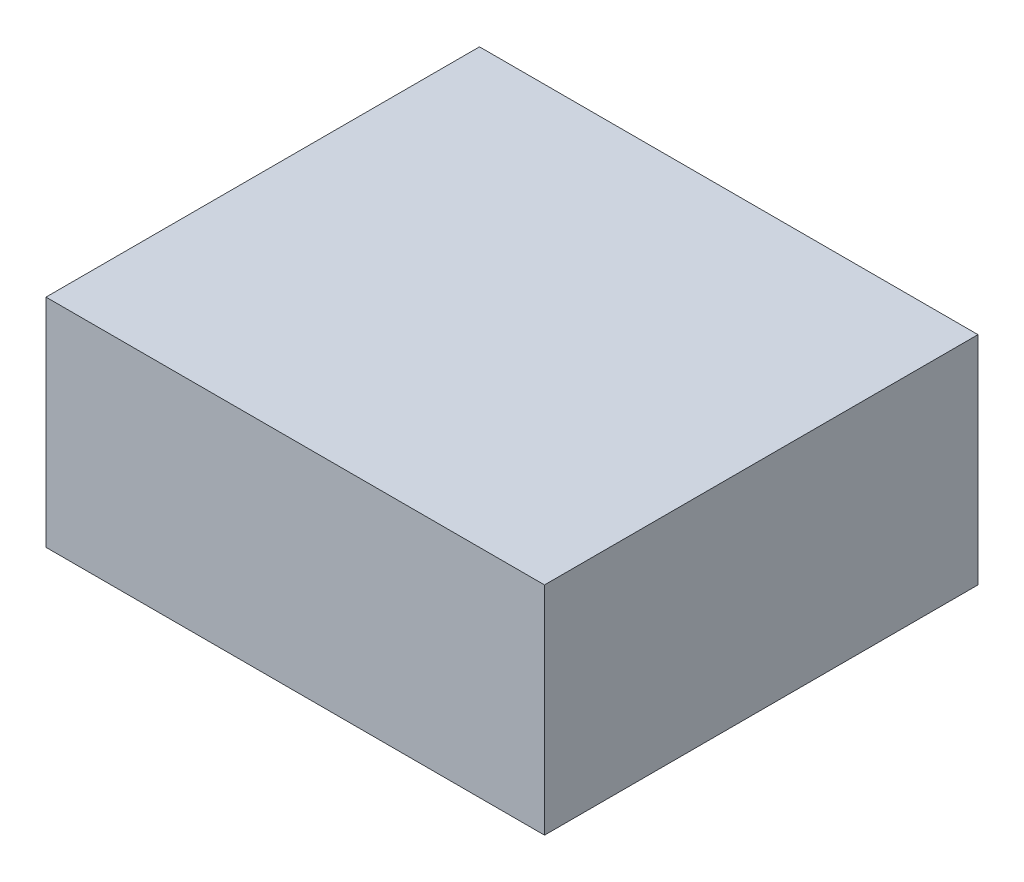
ISO-10303-21;
HEADER;
FILE_DESCRIPTION(('STEP AP214'),'2;1');
FILE_NAME('part.step','',(''),(''),'','','');
FILE_SCHEMA(('AUTOMOTIVE_DESIGN { 1 0 10303 214 1 1 1 1 }'));
ENDSEC;
DATA;
#1=APPLICATION_CONTEXT('core data for automotive mechanical design processes');
#2=APPLICATION_PROTOCOL_DEFINITION('international standard','automotive_design',2000,#1);
#3=PRODUCT_CONTEXT('',#1,'mechanical');
#4=PRODUCT('Part','Part','',(#3));
#5=PRODUCT_RELATED_PRODUCT_CATEGORY('part','',(#4));
#6=PRODUCT_DEFINITION_FORMATION('','',#4);
#7=PRODUCT_DEFINITION_CONTEXT('part definition',#1,'design');
#8=PRODUCT_DEFINITION('design','',#6,#7);
#9=PRODUCT_DEFINITION_SHAPE('','',#8);
#10=(LENGTH_UNIT() NAMED_UNIT(*) SI_UNIT(.MILLI.,.METRE.));
#11=(NAMED_UNIT(*) PLANE_ANGLE_UNIT() SI_UNIT($,.RADIAN.));
#12=(NAMED_UNIT(*) SI_UNIT($,.STERADIAN.) SOLID_ANGLE_UNIT());
#13=UNCERTAINTY_MEASURE_WITH_UNIT(LENGTH_MEASURE(1.E-05),#10,'distance_accuracy_value','');
#14=(GEOMETRIC_REPRESENTATION_CONTEXT(3) GLOBAL_UNCERTAINTY_ASSIGNED_CONTEXT((#13)) GLOBAL_UNIT_ASSIGNED_CONTEXT((#10,
#11,#12)) REPRESENTATION_CONTEXT('',''));
#15=CARTESIAN_POINT('',(0.,0.,0.));
#16=DIRECTION('',(0.,0.,1.));
#17=DIRECTION('',(1.,0.,0.));
#18=AXIS2_PLACEMENT_3D('',#15,#16,#17);
#19=CARTESIAN_POINT('',(0.,-10.,0.));
#20=DIRECTION('',(-1.,0.,0.));
#21=DIRECTION('',(0.,0.,1.));
#22=AXIS2_PLACEMENT_3D('',#19,#20,#21);
#23=PLANE('',#22);
#24=DIRECTION('',(0.,0.,1.));
#25=VECTOR('',#24,1.);
#26=CARTESIAN_POINT('',(0.,0.,0.));
#27=LINE('',#26,#25);
#28=CARTESIAN_POINT('',(0.,0.,-20.));
#29=VERTEX_POINT('',#28);
#30=CARTESIAN_POINT('',(0.,0.,0.));
#31=VERTEX_POINT('',#30);
#32=EDGE_CURVE('E104',#29,#31,#27,.T.);
#33=ORIENTED_EDGE('',*,*,#32,.F.);
#34=DIRECTION('',(0.,1.,0.));
#35=VECTOR('',#34,1.);
#36=CARTESIAN_POINT('',(0.,-10.,-20.));
#37=LINE('',#36,#35);
#38=CARTESIAN_POINT('',(0.,-10.,-20.));
#39=VERTEX_POINT('',#38);
#40=EDGE_CURVE('E11',#39,#29,#37,.T.);
#41=ORIENTED_EDGE('',*,*,#40,.F.);
#42=DIRECTION('',(0.,0.,1.));
#43=VECTOR('',#42,1.);
#44=CARTESIAN_POINT('',(0.,-10.,0.));
#45=LINE('',#44,#43);
#46=CARTESIAN_POINT('',(0.,-10.,0.));
#47=VERTEX_POINT('',#46);
#48=EDGE_CURVE('E100',#39,#47,#45,.T.);
#49=ORIENTED_EDGE('',*,*,#48,.T.);
#50=DIRECTION('',(0.,1.,0.));
#51=VECTOR('',#50,1.);
#52=CARTESIAN_POINT('',(0.,-10.,0.));
#53=LINE('',#52,#51);
#54=EDGE_CURVE('E45',#47,#31,#53,.T.);
#55=ORIENTED_EDGE('',*,*,#54,.T.);
#56=EDGE_LOOP('',(#33,#41,#49,#55));
#57=FACE_BOUND('',#56,.T.);
#58=ADVANCED_FACE('F39',(#57),#23,.T.);
#59=CARTESIAN_POINT('',(0.,-10.,-20.));
#60=DIRECTION('',(0.,0.,-1.));
#61=DIRECTION('',(-1.,0.,0.));
#62=AXIS2_PLACEMENT_3D('',#59,#60,#61);
#63=PLANE('',#62);
#64=DIRECTION('',(-1.,0.,0.));
#65=VECTOR('',#64,1.);
#66=CARTESIAN_POINT('',(0.,0.,-20.));
#67=LINE('',#66,#65);
#68=CARTESIAN_POINT('',(23.,0.,-20.));
#69=VERTEX_POINT('',#68);
#70=EDGE_CURVE('E98',#69,#29,#67,.T.);
#71=ORIENTED_EDGE('',*,*,#70,.F.);
#72=DIRECTION('',(0.,1.,0.));
#73=VECTOR('',#72,1.);
#74=CARTESIAN_POINT('',(23.,-10.,-20.));
#75=LINE('',#74,#73);
#76=CARTESIAN_POINT('',(23.,-10.,-20.));
#77=VERTEX_POINT('',#76);
#78=EDGE_CURVE('E48',#77,#69,#75,.T.);
#79=ORIENTED_EDGE('',*,*,#78,.F.);
#80=DIRECTION('',(-1.,0.,0.));
#81=VECTOR('',#80,1.);
#82=CARTESIAN_POINT('',(0.,-10.,-20.));
#83=LINE('',#82,#81);
#84=EDGE_CURVE('E92',#77,#39,#83,.T.);
#85=ORIENTED_EDGE('',*,*,#84,.T.);
#86=ORIENTED_EDGE('',*,*,#40,.T.);
#87=EDGE_LOOP('',(#71,#79,#85,#86));
#88=FACE_BOUND('',#87,.T.);
#89=ADVANCED_FACE('F111',(#88),#63,.T.);
#90=CARTESIAN_POINT('',(23.,-10.,0.));
#91=DIRECTION('',(1.,0.,0.));
#92=DIRECTION('',(0.,0.,-1.));
#93=AXIS2_PLACEMENT_3D('',#90,#91,#92);
#94=PLANE('',#93);
#95=DIRECTION('',(0.,0.,-1.));
#96=VECTOR('',#95,1.);
#97=CARTESIAN_POINT('',(23.,0.,0.));
#98=LINE('',#97,#96);
#99=CARTESIAN_POINT('',(23.,0.,0.));
#100=VERTEX_POINT('',#99);
#101=EDGE_CURVE('E87',#100,#69,#98,.T.);
#102=ORIENTED_EDGE('',*,*,#101,.F.);
#103=DIRECTION('',(0.,1.,0.));
#104=VECTOR('',#103,1.);
#105=CARTESIAN_POINT('',(23.,-10.,0.));
#106=LINE('',#105,#104);
#107=CARTESIAN_POINT('',(23.,-10.,0.));
#108=VERTEX_POINT('',#107);
#109=EDGE_CURVE('E84',#108,#100,#106,.T.);
#110=ORIENTED_EDGE('',*,*,#109,.F.);
#111=DIRECTION('',(0.,0.,-1.));
#112=VECTOR('',#111,1.);
#113=CARTESIAN_POINT('',(23.,-10.,0.));
#114=LINE('',#113,#112);
#115=EDGE_CURVE('E90',#108,#77,#114,.T.);
#116=ORIENTED_EDGE('',*,*,#115,.T.);
#117=ORIENTED_EDGE('',*,*,#78,.T.);
#118=EDGE_LOOP('',(#102,#110,#116,#117));
#119=FACE_BOUND('',#118,.T.);
#120=ADVANCED_FACE('F86',(#119),#94,.T.);
#121=CARTESIAN_POINT('',(0.,-10.,0.));
#122=DIRECTION('',(0.,0.,1.));
#123=DIRECTION('',(1.,0.,0.));
#124=AXIS2_PLACEMENT_3D('',#121,#122,#123);
#125=PLANE('',#124);
#126=DIRECTION('',(1.,0.,0.));
#127=VECTOR('',#126,1.);
#128=CARTESIAN_POINT('',(0.,0.,0.));
#129=LINE('',#128,#127);
#130=EDGE_CURVE('E106',#31,#100,#129,.T.);
#131=ORIENTED_EDGE('',*,*,#130,.F.);
#132=ORIENTED_EDGE('',*,*,#54,.F.);
#133=DIRECTION('',(1.,0.,0.));
#134=VECTOR('',#133,1.);
#135=CARTESIAN_POINT('',(0.,-10.,0.));
#136=LINE('',#135,#134);
#137=EDGE_CURVE('E93',#47,#108,#136,.T.);
#138=ORIENTED_EDGE('',*,*,#137,.T.);
#139=ORIENTED_EDGE('',*,*,#109,.T.);
#140=EDGE_LOOP('',(#131,#132,#138,#139));
#141=FACE_BOUND('',#140,.T.);
#142=ADVANCED_FACE('F96',(#141),#125,.T.);
#143=CARTESIAN_POINT('',(0.,-10.,0.));
#144=DIRECTION('',(0.,-1.,0.));
#145=DIRECTION('',(0.,0.,-1.));
#146=AXIS2_PLACEMENT_3D('',#143,#144,#145);
#147=PLANE('',#146);
#148=ORIENTED_EDGE('',*,*,#48,.F.);
#149=ORIENTED_EDGE('',*,*,#84,.F.);
#150=ORIENTED_EDGE('',*,*,#115,.F.);
#151=ORIENTED_EDGE('',*,*,#137,.F.);
#152=EDGE_LOOP('',(#148,#149,#150,#151));
#153=FACE_BOUND('',#152,.T.);
#154=ADVANCED_FACE('F95',(#153),#147,.T.);
#155=CARTESIAN_POINT('',(0.,0.,0.));
#156=DIRECTION('',(0.,-1.,0.));
#157=DIRECTION('',(0.,0.,-1.));
#158=AXIS2_PLACEMENT_3D('',#155,#156,#157);
#159=PLANE('',#158);
#160=ORIENTED_EDGE('',*,*,#32,.T.);
#161=ORIENTED_EDGE('',*,*,#130,.T.);
#162=ORIENTED_EDGE('',*,*,#101,.T.);
#163=ORIENTED_EDGE('',*,*,#70,.T.);
#164=EDGE_LOOP('',(#160,#161,#162,#163));
#165=FACE_BOUND('',#164,.T.);
#166=ADVANCED_FACE('F115',(#165),#159,.F.);
#167=CLOSED_SHELL('',(#58,#89,#120,#142,#154,#166));
#168=MANIFOLD_SOLID_BREP('B2',#167);
#169=ADVANCED_BREP_SHAPE_REPRESENTATION('',(#18,#168),#14);
#170=SHAPE_DEFINITION_REPRESENTATION(#9,#169);
ENDSEC;
END-ISO-10303-21;
